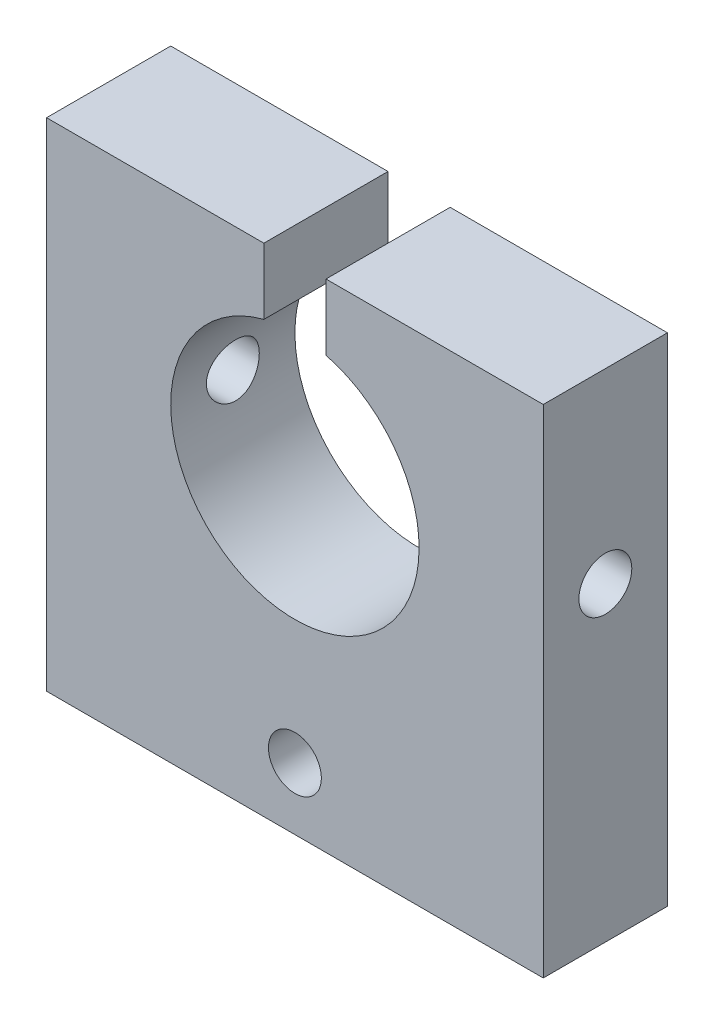
ISO-10303-21;
HEADER;
FILE_DESCRIPTION(('STEP AP214'),'2;1');
FILE_NAME('part.step','',(''),(''),'','','');
FILE_SCHEMA(('AUTOMOTIVE_DESIGN { 1 0 10303 214 1 1 1 1 }'));
ENDSEC;
DATA;
#1=APPLICATION_CONTEXT('core data for automotive mechanical design processes');
#2=APPLICATION_PROTOCOL_DEFINITION('international standard','automotive_design',2000,#1);
#3=PRODUCT_CONTEXT('',#1,'mechanical');
#4=PRODUCT('Part','Part','',(#3));
#5=PRODUCT_RELATED_PRODUCT_CATEGORY('part','',(#4));
#6=PRODUCT_DEFINITION_FORMATION('','',#4);
#7=PRODUCT_DEFINITION_CONTEXT('part definition',#1,'design');
#8=PRODUCT_DEFINITION('design','',#6,#7);
#9=PRODUCT_DEFINITION_SHAPE('','',#8);
#10=(LENGTH_UNIT() NAMED_UNIT(*) SI_UNIT(.MILLI.,.METRE.));
#11=(NAMED_UNIT(*) PLANE_ANGLE_UNIT() SI_UNIT($,.RADIAN.));
#12=(NAMED_UNIT(*) SI_UNIT($,.STERADIAN.) SOLID_ANGLE_UNIT());
#13=UNCERTAINTY_MEASURE_WITH_UNIT(LENGTH_MEASURE(1.E-05),#10,'distance_accuracy_value','');
#14=(GEOMETRIC_REPRESENTATION_CONTEXT(3) GLOBAL_UNCERTAINTY_ASSIGNED_CONTEXT((#13)) GLOBAL_UNIT_ASSIGNED_CONTEXT((#10,
#11,#12)) REPRESENTATION_CONTEXT('',''));
#15=CARTESIAN_POINT('',(0.,0.,0.));
#16=DIRECTION('',(0.,0.,1.));
#17=DIRECTION('',(1.,0.,0.));
#18=AXIS2_PLACEMENT_3D('',#15,#16,#17);
#19=CARTESIAN_POINT('',(-12.7,12.7,6.35));
#20=DIRECTION('',(0.,-1.,0.));
#21=DIRECTION('',(0.,0.,-1.));
#22=AXIS2_PLACEMENT_3D('',#19,#20,#21);
#23=PLANE('',#22);
#24=DIRECTION('',(0.,0.,1.));
#25=VECTOR('',#24,1.);
#26=CARTESIAN_POINT('',(-1.5875,12.7,0.));
#27=LINE('',#26,#25);
#28=CARTESIAN_POINT('',(-1.5875,12.7,0.));
#29=VERTEX_POINT('',#28);
#30=CARTESIAN_POINT('',(-1.5875,12.7,6.35));
#31=VERTEX_POINT('',#30);
#32=EDGE_CURVE('E164',#29,#31,#27,.T.);
#33=ORIENTED_EDGE('',*,*,#32,.F.);
#34=DIRECTION('',(-1.,0.,0.));
#35=VECTOR('',#34,1.);
#36=CARTESIAN_POINT('',(-12.7,12.7,0.));
#37=LINE('',#36,#35);
#38=CARTESIAN_POINT('',(-12.7,12.7,0.));
#39=VERTEX_POINT('',#38);
#40=EDGE_CURVE('E184',#29,#39,#37,.T.);
#41=ORIENTED_EDGE('',*,*,#40,.T.);
#42=DIRECTION('',(0.,0.,-1.));
#43=VECTOR('',#42,1.);
#44=CARTESIAN_POINT('',(-12.7,12.7,6.35));
#45=LINE('',#44,#43);
#46=CARTESIAN_POINT('',(-12.7,12.7,6.35));
#47=VERTEX_POINT('',#46);
#48=EDGE_CURVE('E56',#47,#39,#45,.T.);
#49=ORIENTED_EDGE('',*,*,#48,.F.);
#50=DIRECTION('',(-1.,0.,0.));
#51=VECTOR('',#50,1.);
#52=CARTESIAN_POINT('',(-12.7,12.7,6.35));
#53=LINE('',#52,#51);
#54=EDGE_CURVE('E172',#31,#47,#53,.T.);
#55=ORIENTED_EDGE('',*,*,#54,.F.);
#56=EDGE_LOOP('',(#33,#41,#49,#55));
#57=FACE_BOUND('',#56,.T.);
#58=ADVANCED_FACE('F41',(#57),#23,.F.);
#59=CARTESIAN_POINT('',(0.,0.,6.35));
#60=DIRECTION('',(0.,0.,-1.));
#61=DIRECTION('',(-1.,0.,0.));
#62=AXIS2_PLACEMENT_3D('',#59,#60,#61);
#63=PLANE('',#62);
#64=CARTESIAN_POINT('',(0.,-9.525,6.35));
#65=DIRECTION('',(0.,0.,1.));
#66=DIRECTION('',(1.,0.,0.));
#67=AXIS2_PLACEMENT_3D('',#64,#65,#66);
#68=CIRCLE('',#67,1.35254999999999);
#69=CARTESIAN_POINT('',(1.35254999999999,-9.525,6.35));
#70=VERTEX_POINT('',#69);
#71=EDGE_CURVE('E275',#70,#70,#68,.T.);
#72=ORIENTED_EDGE('',*,*,#71,.F.);
#73=EDGE_LOOP('',(#72));
#74=FACE_BOUND('',#73,.T.);
#75=DIRECTION('',(0.,1.,0.));
#76=VECTOR('',#75,1.);
#77=CARTESIAN_POINT('',(-1.5875,0.,6.35));
#78=LINE('',#77,#76);
#79=CARTESIAN_POINT('',(-1.5875,9.32336106210428,6.35));
#80=VERTEX_POINT('',#79);
#81=EDGE_CURVE('E144',#80,#31,#78,.T.);
#82=ORIENTED_EDGE('',*,*,#81,.T.);
#83=ORIENTED_EDGE('',*,*,#54,.T.);
#84=DIRECTION('',(0.,-1.,0.));
#85=VECTOR('',#84,1.);
#86=CARTESIAN_POINT('',(-12.7,-12.7,6.35));
#87=LINE('',#86,#85);
#88=CARTESIAN_POINT('',(-12.7,-12.7,6.35));
#89=VERTEX_POINT('',#88);
#90=EDGE_CURVE('E175',#47,#89,#87,.T.);
#91=ORIENTED_EDGE('',*,*,#90,.T.);
#92=DIRECTION('',(1.,0.,0.));
#93=VECTOR('',#92,1.);
#94=CARTESIAN_POINT('',(-12.7,-12.7,6.35));
#95=LINE('',#94,#93);
#96=CARTESIAN_POINT('',(12.7,-12.7,6.35));
#97=VERTEX_POINT('',#96);
#98=EDGE_CURVE('E73',#89,#97,#95,.T.);
#99=ORIENTED_EDGE('',*,*,#98,.T.);
#100=DIRECTION('',(0.,1.,0.));
#101=VECTOR('',#100,1.);
#102=CARTESIAN_POINT('',(12.7,-12.7,6.35));
#103=LINE('',#102,#101);
#104=CARTESIAN_POINT('',(12.7,12.7,6.35));
#105=VERTEX_POINT('',#104);
#106=EDGE_CURVE('E169',#97,#105,#103,.T.);
#107=ORIENTED_EDGE('',*,*,#106,.T.);
#108=CARTESIAN_POINT('',(1.5875,12.7,6.35));
#109=VERTEX_POINT('',#108);
#110=EDGE_CURVE('E100',#105,#109,#53,.T.);
#111=ORIENTED_EDGE('',*,*,#110,.T.);
#112=DIRECTION('',(0.,1.,0.));
#113=VECTOR('',#112,1.);
#114=CARTESIAN_POINT('',(1.5875,0.,6.35));
#115=LINE('',#114,#113);
#116=CARTESIAN_POINT('',(1.5875,9.32336106210428,6.35));
#117=VERTEX_POINT('',#116);
#118=EDGE_CURVE('E148',#117,#109,#115,.T.);
#119=ORIENTED_EDGE('',*,*,#118,.F.);
#120=CARTESIAN_POINT('',(0.,3.175,6.35));
#121=DIRECTION('',(0.,0.,1.));
#122=DIRECTION('',(1.,0.,0.));
#123=AXIS2_PLACEMENT_3D('',#120,#121,#122);
#124=CIRCLE('',#123,6.35);
#125=EDGE_CURVE('E130',#80,#117,#124,.T.);
#126=ORIENTED_EDGE('',*,*,#125,.F.);
#127=EDGE_LOOP('',(#82,#83,#91,#99,#107,#111,#119,#126));
#128=FACE_BOUND('',#127,.T.);
#129=ADVANCED_FACE('F227',(#74,#128),#63,.F.);
#130=CARTESIAN_POINT('',(0.,0.,0.));
#131=DIRECTION('',(0.,0.,-1.));
#132=DIRECTION('',(-1.,0.,0.));
#133=AXIS2_PLACEMENT_3D('',#130,#131,#132);
#134=PLANE('',#133);
#135=CARTESIAN_POINT('',(0.,-9.525,0.));
#136=DIRECTION('',(0.,0.,-1.));
#137=DIRECTION('',(-1.,0.,0.));
#138=AXIS2_PLACEMENT_3D('',#135,#136,#137);
#139=CIRCLE('',#138,1.35254999999999);
#140=CARTESIAN_POINT('',(-1.35254999999999,-9.525,0.));
#141=VERTEX_POINT('',#140);
#142=EDGE_CURVE('E271',#141,#141,#139,.T.);
#143=ORIENTED_EDGE('',*,*,#142,.F.);
#144=EDGE_LOOP('',(#143));
#145=FACE_BOUND('',#144,.T.);
#146=ORIENTED_EDGE('',*,*,#40,.F.);
#147=DIRECTION('',(0.,1.,0.));
#148=VECTOR('',#147,1.);
#149=CARTESIAN_POINT('',(-1.5875,0.,0.));
#150=LINE('',#149,#148);
#151=CARTESIAN_POINT('',(-1.5875,9.32336106210428,0.));
#152=VERTEX_POINT('',#151);
#153=EDGE_CURVE('E133',#152,#29,#150,.T.);
#154=ORIENTED_EDGE('',*,*,#153,.F.);
#155=CARTESIAN_POINT('',(0.,3.175,0.));
#156=DIRECTION('',(0.,0.,1.));
#157=DIRECTION('',(1.,0.,0.));
#158=AXIS2_PLACEMENT_3D('',#155,#156,#157);
#159=CIRCLE('',#158,6.35);
#160=CARTESIAN_POINT('',(1.5875,9.32336106210428,0.));
#161=VERTEX_POINT('',#160);
#162=EDGE_CURVE('E127',#152,#161,#159,.T.);
#163=ORIENTED_EDGE('',*,*,#162,.T.);
#164=DIRECTION('',(0.,1.,0.));
#165=VECTOR('',#164,1.);
#166=CARTESIAN_POINT('',(1.5875,0.,0.));
#167=LINE('',#166,#165);
#168=CARTESIAN_POINT('',(1.5875,12.7,0.));
#169=VERTEX_POINT('',#168);
#170=EDGE_CURVE('E135',#161,#169,#167,.T.);
#171=ORIENTED_EDGE('',*,*,#170,.T.);
#172=CARTESIAN_POINT('',(12.7,12.7,0.));
#173=VERTEX_POINT('',#172);
#174=EDGE_CURVE('E185',#173,#169,#37,.T.);
#175=ORIENTED_EDGE('',*,*,#174,.F.);
#176=DIRECTION('',(0.,1.,0.));
#177=VECTOR('',#176,1.);
#178=CARTESIAN_POINT('',(12.7,-12.7,0.));
#179=LINE('',#178,#177);
#180=CARTESIAN_POINT('',(12.7,-12.7,0.));
#181=VERTEX_POINT('',#180);
#182=EDGE_CURVE('E163',#181,#173,#179,.T.);
#183=ORIENTED_EDGE('',*,*,#182,.F.);
#184=DIRECTION('',(1.,0.,0.));
#185=VECTOR('',#184,1.);
#186=CARTESIAN_POINT('',(-12.7,-12.7,0.));
#187=LINE('',#186,#185);
#188=CARTESIAN_POINT('',(-12.7,-12.7,0.));
#189=VERTEX_POINT('',#188);
#190=EDGE_CURVE('E94',#189,#181,#187,.T.);
#191=ORIENTED_EDGE('',*,*,#190,.F.);
#192=DIRECTION('',(0.,-1.,0.));
#193=VECTOR('',#192,1.);
#194=CARTESIAN_POINT('',(-12.7,-12.7,0.));
#195=LINE('',#194,#193);
#196=EDGE_CURVE('E188',#39,#189,#195,.T.);
#197=ORIENTED_EDGE('',*,*,#196,.F.);
#198=EDGE_LOOP('',(#146,#154,#163,#171,#175,#183,#191,#197));
#199=FACE_BOUND('',#198,.T.);
#200=ADVANCED_FACE('F142',(#145,#199),#134,.T.);
#201=CARTESIAN_POINT('',(12.7,-12.7,6.35));
#202=DIRECTION('',(-1.,0.,0.));
#203=DIRECTION('',(0.,0.,1.));
#204=AXIS2_PLACEMENT_3D('',#201,#202,#203);
#205=PLANE('',#204);
#206=CARTESIAN_POINT('',(12.7,3.175,3.175));
#207=DIRECTION('',(1.,0.,0.));
#208=DIRECTION('',(0.,0.,-1.));
#209=AXIS2_PLACEMENT_3D('',#206,#207,#208);
#210=CIRCLE('',#209,1.35255);
#211=CARTESIAN_POINT('',(12.7,3.175,1.82245));
#212=VERTEX_POINT('',#211);
#213=EDGE_CURVE('E274',#212,#212,#210,.T.);
#214=ORIENTED_EDGE('',*,*,#213,.F.);
#215=EDGE_LOOP('',(#214));
#216=FACE_BOUND('',#215,.T.);
#217=ORIENTED_EDGE('',*,*,#182,.T.);
#218=DIRECTION('',(0.,0.,-1.));
#219=VECTOR('',#218,1.);
#220=CARTESIAN_POINT('',(12.7,12.7,6.35));
#221=LINE('',#220,#219);
#222=EDGE_CURVE('E11',#105,#173,#221,.T.);
#223=ORIENTED_EDGE('',*,*,#222,.F.);
#224=ORIENTED_EDGE('',*,*,#106,.F.);
#225=DIRECTION('',(0.,0.,-1.));
#226=VECTOR('',#225,1.);
#227=CARTESIAN_POINT('',(12.7,-12.7,6.35));
#228=LINE('',#227,#226);
#229=EDGE_CURVE('E180',#97,#181,#228,.T.);
#230=ORIENTED_EDGE('',*,*,#229,.T.);
#231=EDGE_LOOP('',(#217,#223,#224,#230));
#232=FACE_BOUND('',#231,.T.);
#233=ADVANCED_FACE('F43',(#216,#232),#205,.F.);
#234=ORIENTED_EDGE('',*,*,#174,.T.);
#235=DIRECTION('',(0.,0.,1.));
#236=VECTOR('',#235,1.);
#237=CARTESIAN_POINT('',(1.5875,12.7,0.));
#238=LINE('',#237,#236);
#239=EDGE_CURVE('E64',#169,#109,#238,.T.);
#240=ORIENTED_EDGE('',*,*,#239,.T.);
#241=ORIENTED_EDGE('',*,*,#110,.F.);
#242=ORIENTED_EDGE('',*,*,#222,.T.);
#243=EDGE_LOOP('',(#234,#240,#241,#242));
#244=FACE_BOUND('',#243,.T.);
#245=ADVANCED_FACE('F229',(#244),#23,.F.);
#246=CARTESIAN_POINT('',(-12.7,-12.7,6.35));
#247=DIRECTION('',(1.,0.,0.));
#248=DIRECTION('',(0.,0.,-1.));
#249=AXIS2_PLACEMENT_3D('',#246,#247,#248);
#250=PLANE('',#249);
#251=CARTESIAN_POINT('',(-12.7,3.175,3.175));
#252=DIRECTION('',(1.,0.,0.));
#253=DIRECTION('',(0.,0.,-1.));
#254=AXIS2_PLACEMENT_3D('',#251,#252,#253);
#255=CIRCLE('',#254,1.35255);
#256=CARTESIAN_POINT('',(-12.7,3.175,1.82245));
#257=VERTEX_POINT('',#256);
#258=EDGE_CURVE('E151',#257,#257,#255,.T.);
#259=ORIENTED_EDGE('',*,*,#258,.T.);
#260=EDGE_LOOP('',(#259));
#261=FACE_BOUND('',#260,.T.);
#262=ORIENTED_EDGE('',*,*,#196,.T.);
#263=DIRECTION('',(0.,0.,-1.));
#264=VECTOR('',#263,1.);
#265=CARTESIAN_POINT('',(-12.7,-12.7,6.35));
#266=LINE('',#265,#264);
#267=EDGE_CURVE('E195',#89,#189,#266,.T.);
#268=ORIENTED_EDGE('',*,*,#267,.F.);
#269=ORIENTED_EDGE('',*,*,#90,.F.);
#270=ORIENTED_EDGE('',*,*,#48,.T.);
#271=EDGE_LOOP('',(#262,#268,#269,#270));
#272=FACE_BOUND('',#271,.T.);
#273=ADVANCED_FACE('F237',(#261,#272),#250,.F.);
#274=CARTESIAN_POINT('',(-12.7,-12.7,6.35));
#275=DIRECTION('',(0.,1.,0.));
#276=DIRECTION('',(0.,0.,1.));
#277=AXIS2_PLACEMENT_3D('',#274,#275,#276);
#278=PLANE('',#277);
#279=ORIENTED_EDGE('',*,*,#190,.T.);
#280=ORIENTED_EDGE('',*,*,#229,.F.);
#281=ORIENTED_EDGE('',*,*,#98,.F.);
#282=ORIENTED_EDGE('',*,*,#267,.T.);
#283=EDGE_LOOP('',(#279,#280,#281,#282));
#284=FACE_BOUND('',#283,.T.);
#285=ADVANCED_FACE('F242',(#284),#278,.F.);
#286=CARTESIAN_POINT('',(0.,3.175,0.));
#287=DIRECTION('',(0.,0.,1.));
#288=DIRECTION('',(1.,0.,0.));
#289=AXIS2_PLACEMENT_3D('',#286,#287,#288);
#290=CYLINDRICAL_SURFACE('',#289,6.35);
#291=CARTESIAN_POINT('',(-6.35,3.175,1.82245));
#292=CARTESIAN_POINT('',(-6.34999861096238,3.09993538591815,1.82245262926583));
#293=CARTESIAN_POINT('',(-6.34865540088409,3.02483854997194,1.82872007342242));
#294=CARTESIAN_POINT('',(-6.34342675076645,2.87677470366032,1.85360015835992));
#295=CARTESIAN_POINT('',(-6.33953943023363,2.8038093104702,1.87222193105149));
#296=CARTESIAN_POINT('',(-6.32965577699744,2.66216987434309,1.921203560802));
#297=CARTESIAN_POINT('',(-6.32366159067733,2.59349154746828,1.95155147489093));
#298=CARTESIAN_POINT('',(-6.31021261659612,2.46220457996255,2.0230867641681));
#299=CARTESIAN_POINT('',(-6.30275788196482,2.39959571866884,2.06427374508651));
#300=CARTESIAN_POINT('',(-6.28707845908267,2.28126627047003,2.15698358759373));
#301=CARTESIAN_POINT('',(-6.27884463503177,2.22565160049843,2.20864010254452));
#302=CARTESIAN_POINT('',(-6.26260005999281,2.12380723138223,2.32053562126354));
#303=CARTESIAN_POINT('',(-6.25458932813968,2.07757833514267,2.38077535853312));
#304=CARTESIAN_POINT('',(-6.23960815322763,1.99535565482606,2.50890378803313));
#305=CARTESIAN_POINT('',(-6.2326494324559,1.95947365780367,2.576865709017));
#306=CARTESIAN_POINT('',(-6.22069088315544,1.89968010221937,2.71802717832486));
#307=CARTESIAN_POINT('',(-6.21569083337164,1.87576719152262,2.79122613395837));
#308=CARTESIAN_POINT('',(-6.20830861045501,1.84093871253762,2.93963776815441));
#309=CARTESIAN_POINT('',(-6.20588881195717,1.82983614087656,3.01480465072955));
#310=CARTESIAN_POINT('',(-6.20382799290792,1.82036222848879,3.16597015748742));
#311=CARTESIAN_POINT('',(-6.20418664902391,1.82198940638376,3.24196868386278));
#312=CARTESIAN_POINT('',(-6.20760811333917,1.83777809272887,3.39125693875617));
#313=CARTESIAN_POINT('',(-6.21062424863921,1.85172327264219,3.46457077708714));
#314=CARTESIAN_POINT('',(-6.21894713261562,1.89140977862657,3.60779389654533));
#315=CARTESIAN_POINT('',(-6.22425400382448,1.91715173571702,3.67770299532887));
#316=CARTESIAN_POINT('',(-6.23660694361686,1.97990219348835,3.81274512270446));
#317=CARTESIAN_POINT('',(-6.2436659001367,2.01699467935456,3.87783789770982));
#318=CARTESIAN_POINT('',(-6.25871962533894,2.10133415901498,4.00095569095366));
#319=CARTESIAN_POINT('',(-6.26671451525981,2.14858246903342,4.05897979154281));
#320=CARTESIAN_POINT('',(-6.2829401548711,2.25304165655205,4.16755951230373));
#321=CARTESIAN_POINT('',(-6.29117238219288,2.31043670419221,4.21793789717209));
#322=CARTESIAN_POINT('',(-6.30679580872777,2.43295274503654,4.30838205820036));
#323=CARTESIAN_POINT('',(-6.31418699419339,2.49807386449388,4.34844766580335));
#324=CARTESIAN_POINT('',(-6.32731762757995,2.6344036953267,4.41716926064537));
#325=CARTESIAN_POINT('',(-6.33305384273191,2.70562397355697,4.44580295843356));
#326=CARTESIAN_POINT('',(-6.34220404917476,2.8520141290711,4.49064801425359));
#327=CARTESIAN_POINT('',(-6.34561836032498,2.92718346080634,4.50686108335711));
#328=CARTESIAN_POINT('',(-6.34969483950222,3.07781680240928,4.52614902949334));
#329=CARTESIAN_POINT('',(-6.35040774522149,3.15324846115058,4.52946614904166));
#330=CARTESIAN_POINT('',(-6.34914287490065,3.30358808246958,4.52352330025944));
#331=CARTESIAN_POINT('',(-6.34716527145521,3.37849607833014,4.51426413869039));
#332=CARTESIAN_POINT('',(-6.34077352324428,3.52486603445753,4.48363256614094));
#333=CARTESIAN_POINT('',(-6.33638477329703,3.59635560989196,4.46238634417797));
#334=CARTESIAN_POINT('',(-6.32566160887463,3.73475672690124,4.40852313313308));
#335=CARTESIAN_POINT('',(-6.319327034669,3.80166789208809,4.37590521053168));
#336=CARTESIAN_POINT('',(-6.30528928586048,3.93002080480522,4.29971371428637));
#337=CARTESIAN_POINT('',(-6.29756861532477,3.99137545939021,4.25599671713869));
#338=CARTESIAN_POINT('',(-6.28165242253473,4.10596482904166,4.1590378895313));
#339=CARTESIAN_POINT('',(-6.27345684209811,4.15919854627922,4.1057948903443));
#340=CARTESIAN_POINT('',(-6.25734058926711,4.25698553722145,3.99018650001011));
#341=CARTESIAN_POINT('',(-6.2494271894923,4.30137150514529,3.92767839626009));
#342=CARTESIAN_POINT('',(-6.23493483661359,4.37901575994887,3.79595226908074));
#343=CARTESIAN_POINT('',(-6.22835582689793,4.41227451894147,3.72673453049317));
#344=CARTESIAN_POINT('',(-6.21733781696005,4.46650180342355,3.58391968084998));
#345=CARTESIAN_POINT('',(-6.21288706126122,4.48753798284657,3.51034920943202));
#346=CARTESIAN_POINT('',(-6.20660704857691,4.51692355845652,3.36061138055767));
#347=CARTESIAN_POINT('',(-6.20477739714954,4.5252748635624,3.28444441560615));
#348=CARTESIAN_POINT('',(-6.20397068907973,4.52897567572369,3.13336026780643));
#349=CARTESIAN_POINT('',(-6.20493549674239,4.52459015346797,3.05844976296864));
#350=CARTESIAN_POINT('',(-6.2094780181016,4.50353178134123,2.91046112369889));
#351=CARTESIAN_POINT('',(-6.21305570424063,4.48685906106091,2.83738296994988));
#352=CARTESIAN_POINT('',(-6.22239325528925,4.44182455867662,2.69533076051665));
#353=CARTESIAN_POINT('',(-6.2281462721772,4.41349943440763,2.62634460348017));
#354=CARTESIAN_POINT('',(-6.24118930990988,4.34599639387991,2.49406364974268));
#355=CARTESIAN_POINT('',(-6.24847948123034,4.30681741499343,2.43076941110316));
#356=CARTESIAN_POINT('',(-6.26395040356261,4.217831728932,2.31035858217255));
#357=CARTESIAN_POINT('',(-6.27214556837561,4.16783538063987,2.25338396540364));
#358=CARTESIAN_POINT('',(-6.28840421224361,4.05902082211327,2.14854601418252));
#359=CARTESIAN_POINT('',(-6.29646766049923,4.00020058042068,2.10068478360923));
#360=CARTESIAN_POINT('',(-6.31167047796941,3.87454633742104,2.01487709781633));
#361=CARTESIAN_POINT('',(-6.31879741398043,3.80762356221812,1.97705832380208));
#362=CARTESIAN_POINT('',(-6.33120028356376,3.66823534820011,1.91326532799377));
#363=CARTESIAN_POINT('',(-6.33647780542986,3.59577473081131,1.88728093694708));
#364=CARTESIAN_POINT('',(-6.34361905124058,3.4651768273112,1.85265256521987));
#365=CARTESIAN_POINT('',(-6.3459973461906,3.40775826967046,1.84134775961253));
#366=CARTESIAN_POINT('',(-6.34918833005957,3.29189962831609,1.82624560372686));
#367=CARTESIAN_POINT('',(-6.35000108176889,3.23345958566675,1.82244795235355));
#368=CARTESIAN_POINT('',(-6.35,3.175,1.82245));
#369=B_SPLINE_CURVE_WITH_KNOTS('',3,(#291,#292,#293,#294,#295,#296,#297,#298,#299,#300,#301,
#302,#303,#304,#305,#306,#307,#308,#309,#310,#311,#312,#313,#314,#315,#316,#317,#318,#319,#320,
#321,#322,#323,#324,#325,#326,#327,#328,#329,#330,#331,#332,#333,#334,#335,#336,#337,#338,#339,
#340,#341,#342,#343,#344,#345,#346,#347,#348,#349,#350,#351,#352,#353,#354,#355,#356,#357,#358,
#359,#360,#361,#362,#363,#364,#365,#366,#367,#368),.UNSPECIFIED.,.T.,.F.,(4,2,2,2,2,2,2,2,2,2,2,
2,2,2,2,2,2,2,2,2,2,2,2,2,2,2,2,2,2,2,2,2,2,2,2,2,2,2,4),(0.,0.224979895980791,
0.450126275209805,0.675043946749969,0.899953438065848,1.12793886928433,1.355943795283,
1.58632693132888,1.81668403536191,2.04363409247308,2.27055773948938,2.4935736737059,
2.71660153862233,2.94132126356155,3.16607013040717,3.39542056996826,3.62477475790389,
3.85457397221981,4.08434152359174,4.3097715649296,4.53518714573761,4.75827288077634,
4.98137693356216,5.20752538847284,5.4337016081621,5.66381649384171,5.89392161481025,
6.12274062574887,6.35152519880278,6.57558456164184,6.79964156140386,7.02299901575425,
7.24637834526043,7.47404733340154,7.70176881671731,7.93226022587936,8.16255319898054,
8.33777236451396,8.51298450226031),.UNSPECIFIED.);
#370=CARTESIAN_POINT('',(-6.35,3.175,1.82245));
#371=VERTEX_POINT('',#370);
#372=EDGE_CURVE('E45',#371,#371,#369,.T.);
#373=ORIENTED_EDGE('',*,*,#372,.T.);
#374=EDGE_LOOP('',(#373));
#375=FACE_BOUND('',#374,.T.);
#376=CARTESIAN_POINT('',(6.35,3.175,1.82245));
#377=CARTESIAN_POINT('',(6.34999861096238,3.25006461408184,1.82245262926583));
#378=CARTESIAN_POINT('',(6.34865540088409,3.32516145002805,1.82872007342242));
#379=CARTESIAN_POINT('',(6.34342675076645,3.47322529633967,1.85360015835992));
#380=CARTESIAN_POINT('',(6.33953943023364,3.54619068952979,1.87222193105149));
#381=CARTESIAN_POINT('',(6.32965577699744,3.6878301256569,1.921203560802));
#382=CARTESIAN_POINT('',(6.32366159067733,3.75650845253171,1.95155147489093));
#383=CARTESIAN_POINT('',(6.31021261659613,3.88779542003744,2.0230867641681));
#384=CARTESIAN_POINT('',(6.30275788196482,3.95040428133116,2.06427374508651));
#385=CARTESIAN_POINT('',(6.28707845908267,4.06873372952997,2.15698358759373));
#386=CARTESIAN_POINT('',(6.27884463503177,4.12434839950157,2.20864010254452));
#387=CARTESIAN_POINT('',(6.26260005999281,4.22619276861777,2.32053562126354));
#388=CARTESIAN_POINT('',(6.25458932813968,4.27242166485733,2.38077535853312));
#389=CARTESIAN_POINT('',(6.23960815322763,4.35464434517394,2.50890378803313));
#390=CARTESIAN_POINT('',(6.2326494324559,4.39052634219632,2.576865709017));
#391=CARTESIAN_POINT('',(6.22069088315544,4.45031989778063,2.71802717832486));
#392=CARTESIAN_POINT('',(6.21569083337164,4.47423280847738,2.79122613395837));
#393=CARTESIAN_POINT('',(6.20830861045501,4.50906128746238,2.93963776815441));
#394=CARTESIAN_POINT('',(6.20588881195717,4.52016385912344,3.01480465072955));
#395=CARTESIAN_POINT('',(6.20382799290792,4.5296377715112,3.16597015748742));
#396=CARTESIAN_POINT('',(6.20418664902391,4.52801059361623,3.24196868386278));
#397=CARTESIAN_POINT('',(6.20760811333918,4.51222190727113,3.39125693875617));
#398=CARTESIAN_POINT('',(6.21062424863921,4.4982767273578,3.46457077708714));
#399=CARTESIAN_POINT('',(6.21894713261562,4.45859022137342,3.60779389654533));
#400=CARTESIAN_POINT('',(6.22425400382448,4.43284826428298,3.67770299532887));
#401=CARTESIAN_POINT('',(6.23660694361687,4.37009780651164,3.81274512270446));
#402=CARTESIAN_POINT('',(6.2436659001367,4.33300532064544,3.87783789770983));
#403=CARTESIAN_POINT('',(6.25871962533894,4.24866584098501,4.00095569095366));
#404=CARTESIAN_POINT('',(6.26671451525981,4.20141753096658,4.05897979154281));
#405=CARTESIAN_POINT('',(6.28294015487111,4.09695834344795,4.16755951230373));
#406=CARTESIAN_POINT('',(6.29117238219288,4.03956329580778,4.21793789717209));
#407=CARTESIAN_POINT('',(6.30679580872777,3.91704725496345,4.30838205820036));
#408=CARTESIAN_POINT('',(6.31418699419339,3.85192613550612,4.34844766580335));
#409=CARTESIAN_POINT('',(6.32731762757996,3.7155963046733,4.41716926064537));
#410=CARTESIAN_POINT('',(6.33305384273191,3.64437602644303,4.44580295843356));
#411=CARTESIAN_POINT('',(6.34220404917476,3.49798587092889,4.49064801425359));
#412=CARTESIAN_POINT('',(6.34561836032498,3.42281653919365,4.50686108335711));
#413=CARTESIAN_POINT('',(6.34969483950222,3.27218319759071,4.52614902949334));
#414=CARTESIAN_POINT('',(6.35040774522149,3.19675153884941,4.52946614904166));
#415=CARTESIAN_POINT('',(6.34914287490065,3.04641191753041,4.52352330025944));
#416=CARTESIAN_POINT('',(6.34716527145521,2.97150392166985,4.51426413869039));
#417=CARTESIAN_POINT('',(6.34077352324428,2.82513396554247,4.48363256614094));
#418=CARTESIAN_POINT('',(6.33638477329703,2.75364439010804,4.46238634417797));
#419=CARTESIAN_POINT('',(6.32566160887463,2.61524327309876,4.40852313313308));
#420=CARTESIAN_POINT('',(6.319327034669,2.5483321079119,4.37590521053168));
#421=CARTESIAN_POINT('',(6.30528928586048,2.41997919519477,4.29971371428637));
#422=CARTESIAN_POINT('',(6.29756861532477,2.35862454060978,4.25599671713869));
#423=CARTESIAN_POINT('',(6.28165242253472,2.24403517095833,4.1590378895313));
#424=CARTESIAN_POINT('',(6.27345684209811,2.19080145372078,4.1057948903443));
#425=CARTESIAN_POINT('',(6.2573405892671,2.09301446277854,3.99018650001011));
#426=CARTESIAN_POINT('',(6.2494271894923,2.0486284948547,3.92767839626009));
#427=CARTESIAN_POINT('',(6.23493483661359,1.97098424005113,3.79595226908074));
#428=CARTESIAN_POINT('',(6.22835582689793,1.93772548105852,3.72673453049317));
#429=CARTESIAN_POINT('',(6.21733781696005,1.88349819657645,3.58391968084998));
#430=CARTESIAN_POINT('',(6.21288706126122,1.86246201715342,3.51034920943202));
#431=CARTESIAN_POINT('',(6.20660704857691,1.83307644154347,3.36061138055767));
#432=CARTESIAN_POINT('',(6.20477739714954,1.82472513643759,3.28444441560615));
#433=CARTESIAN_POINT('',(6.20397068907973,1.8210243242763,3.13336026780643));
#434=CARTESIAN_POINT('',(6.20493549674239,1.82540984653202,3.05844976296864));
#435=CARTESIAN_POINT('',(6.2094780181016,1.84646821865876,2.91046112369889));
#436=CARTESIAN_POINT('',(6.21305570424062,1.86314093893909,2.83738296994988));
#437=CARTESIAN_POINT('',(6.22239325528925,1.90817544132337,2.69533076051665));
#438=CARTESIAN_POINT('',(6.22814627217719,1.93650056559237,2.62634460348016));
#439=CARTESIAN_POINT('',(6.24118930990988,2.00400360612009,2.49406364974268));
#440=CARTESIAN_POINT('',(6.24847948123034,2.04318258500657,2.43076941110316));
#441=CARTESIAN_POINT('',(6.26395040356261,2.13216827106799,2.31035858217255));
#442=CARTESIAN_POINT('',(6.27214556837561,2.18216461936013,2.25338396540364));
#443=CARTESIAN_POINT('',(6.2884042122436,2.29097917788672,2.14854601418252));
#444=CARTESIAN_POINT('',(6.29646766049923,2.34979941957931,2.10068478360923));
#445=CARTESIAN_POINT('',(6.31167047796941,2.47545366257895,2.01487709781633));
#446=CARTESIAN_POINT('',(6.31879741398043,2.54237643778188,1.97705832380207));
#447=CARTESIAN_POINT('',(6.33120028356376,2.68176465179988,1.91326532799377));
#448=CARTESIAN_POINT('',(6.33647780542986,2.75422526918868,1.88728093694708));
#449=CARTESIAN_POINT('',(6.34361905124058,2.8848231726888,1.85265256521987));
#450=CARTESIAN_POINT('',(6.3459973461906,2.94224173032953,1.84134775961253));
#451=CARTESIAN_POINT('',(6.34918833005957,3.05810037168391,1.82624560372686));
#452=CARTESIAN_POINT('',(6.35000108176889,3.11654041433325,1.82244795235355));
#453=CARTESIAN_POINT('',(6.35,3.175,1.82245));
#454=B_SPLINE_CURVE_WITH_KNOTS('',3,(#376,#377,#378,#379,#380,#381,#382,#383,#384,#385,#386,
#387,#388,#389,#390,#391,#392,#393,#394,#395,#396,#397,#398,#399,#400,#401,#402,#403,#404,#405,
#406,#407,#408,#409,#410,#411,#412,#413,#414,#415,#416,#417,#418,#419,#420,#421,#422,#423,#424,
#425,#426,#427,#428,#429,#430,#431,#432,#433,#434,#435,#436,#437,#438,#439,#440,#441,#442,#443,
#444,#445,#446,#447,#448,#449,#450,#451,#452,#453),.UNSPECIFIED.,.T.,.F.,(4,2,2,2,2,2,2,2,2,2,2,
2,2,2,2,2,2,2,2,2,2,2,2,2,2,2,2,2,2,2,2,2,2,2,2,2,2,2,4),(0.,0.224979895980791,
0.450126275209805,0.675043946749969,0.899953438065848,1.12793886928433,1.355943795283,
1.58632693132888,1.81668403536191,2.04363409247308,2.27055773948938,2.4935736737059,
2.71660153862233,2.94132126356155,3.16607013040717,3.39542056996826,3.62477475790389,
3.85457397221981,4.08434152359174,4.3097715649296,4.53518714573761,4.75827288077634,
4.98137693356216,5.20752538847284,5.4337016081621,5.66381649384172,5.89392161481025,
6.12274062574887,6.35152519880278,6.57558456164184,6.79964156140386,7.02299901575425,
7.24637834526043,7.47404733340154,7.70176881671731,7.93226022587936,8.16255319898054,
8.33777236451396,8.51298450226031),.UNSPECIFIED.);
#455=CARTESIAN_POINT('',(6.35,3.175,1.82245));
#456=VERTEX_POINT('',#455);
#457=EDGE_CURVE('E200',#456,#456,#454,.T.);
#458=ORIENTED_EDGE('',*,*,#457,.T.);
#459=EDGE_LOOP('',(#458));
#460=FACE_BOUND('',#459,.T.);
#461=ORIENTED_EDGE('',*,*,#125,.T.);
#462=DIRECTION('',(0.,0.,1.));
#463=VECTOR('',#462,1.);
#464=CARTESIAN_POINT('',(1.5875,9.32336106210428,0.));
#465=LINE('',#464,#463);
#466=EDGE_CURVE('E124',#161,#117,#465,.T.);
#467=ORIENTED_EDGE('',*,*,#466,.F.);
#468=ORIENTED_EDGE('',*,*,#162,.F.);
#469=DIRECTION('',(0.,0.,1.));
#470=VECTOR('',#469,1.);
#471=CARTESIAN_POINT('',(-1.5875,9.32336106210428,0.));
#472=LINE('',#471,#470);
#473=EDGE_CURVE('E160',#152,#80,#472,.T.);
#474=ORIENTED_EDGE('',*,*,#473,.T.);
#475=EDGE_LOOP('',(#461,#467,#468,#474));
#476=FACE_BOUND('',#475,.T.);
#477=ADVANCED_FACE('F125',(#375,#460,#476),#290,.F.);
#478=CARTESIAN_POINT('',(-1.5875,0.,0.));
#479=DIRECTION('',(1.,0.,0.));
#480=DIRECTION('',(0.,1.,0.));
#481=AXIS2_PLACEMENT_3D('',#478,#479,#480);
#482=PLANE('',#481);
#483=ORIENTED_EDGE('',*,*,#81,.F.);
#484=ORIENTED_EDGE('',*,*,#473,.F.);
#485=ORIENTED_EDGE('',*,*,#153,.T.);
#486=ORIENTED_EDGE('',*,*,#32,.T.);
#487=EDGE_LOOP('',(#483,#484,#485,#486));
#488=FACE_BOUND('',#487,.T.);
#489=ADVANCED_FACE('F217',(#488),#482,.T.);
#490=CARTESIAN_POINT('',(1.5875,0.,0.));
#491=DIRECTION('',(1.,0.,0.));
#492=DIRECTION('',(0.,1.,0.));
#493=AXIS2_PLACEMENT_3D('',#490,#491,#492);
#494=PLANE('',#493);
#495=ORIENTED_EDGE('',*,*,#118,.T.);
#496=ORIENTED_EDGE('',*,*,#239,.F.);
#497=ORIENTED_EDGE('',*,*,#170,.F.);
#498=ORIENTED_EDGE('',*,*,#466,.T.);
#499=EDGE_LOOP('',(#495,#496,#497,#498));
#500=FACE_BOUND('',#499,.T.);
#501=ADVANCED_FACE('F136',(#500),#494,.F.);
#502=CARTESIAN_POINT('',(12.7,3.175,3.175));
#503=DIRECTION('',(1.,0.,0.));
#504=DIRECTION('',(0.,0.,-1.));
#505=AXIS2_PLACEMENT_3D('',#502,#503,#504);
#506=CYLINDRICAL_SURFACE('',#505,1.35255);
#507=ORIENTED_EDGE('',*,*,#213,.T.);
#508=EDGE_LOOP('',(#507));
#509=FACE_BOUND('',#508,.T.);
#510=ORIENTED_EDGE('',*,*,#457,.F.);
#511=EDGE_LOOP('',(#510));
#512=FACE_BOUND('',#511,.T.);
#513=ADVANCED_FACE('F215',(#509,#512),#506,.F.);
#514=ORIENTED_EDGE('',*,*,#258,.F.);
#515=EDGE_LOOP('',(#514));
#516=FACE_BOUND('',#515,.T.);
#517=ORIENTED_EDGE('',*,*,#372,.F.);
#518=EDGE_LOOP('',(#517));
#519=FACE_BOUND('',#518,.T.);
#520=ADVANCED_FACE('F209',(#516,#519),#506,.F.);
#521=CARTESIAN_POINT('',(0.,-9.525,6.35));
#522=DIRECTION('',(0.,0.,1.));
#523=DIRECTION('',(1.,0.,0.));
#524=AXIS2_PLACEMENT_3D('',#521,#522,#523);
#525=CYLINDRICAL_SURFACE('',#524,1.35254999999999);
#526=ORIENTED_EDGE('',*,*,#71,.T.);
#527=EDGE_LOOP('',(#526));
#528=FACE_BOUND('',#527,.T.);
#529=ORIENTED_EDGE('',*,*,#142,.T.);
#530=EDGE_LOOP('',(#529));
#531=FACE_BOUND('',#530,.T.);
#532=ADVANCED_FACE('F214',(#528,#531),#525,.F.);
#533=CLOSED_SHELL('',(#58,#129,#200,#233,#245,#273,#285,#477,#489,#501,#513,#520,#532));
#534=MANIFOLD_SOLID_BREP('B2',#533);
#535=ADVANCED_BREP_SHAPE_REPRESENTATION('',(#18,#534),#14);
#536=SHAPE_DEFINITION_REPRESENTATION(#9,#535);
ENDSEC;
END-ISO-10303-21;
